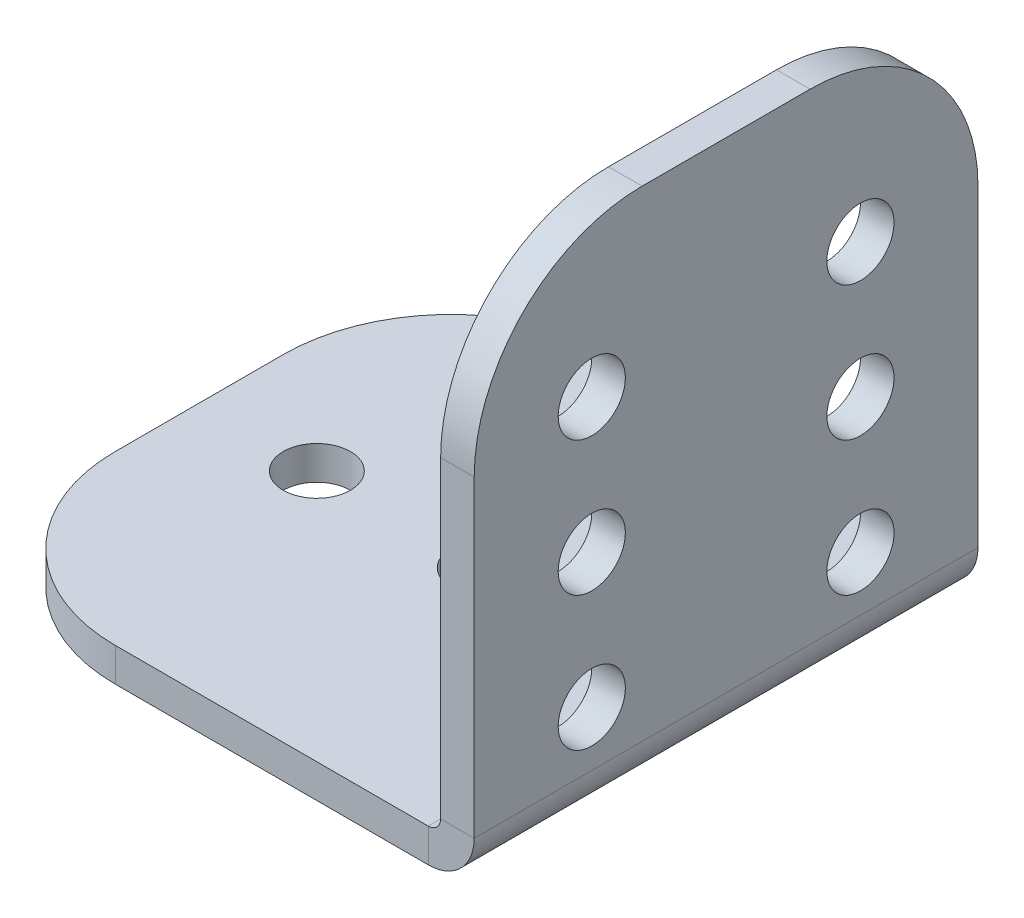
ISO-10303-21;
HEADER;
FILE_DESCRIPTION(('STEP AP214'),'2;1');
FILE_NAME('part.step','',(''),(''),'','','');
FILE_SCHEMA(('AUTOMOTIVE_DESIGN { 1 0 10303 214 1 1 1 1 }'));
ENDSEC;
DATA;
#1=APPLICATION_CONTEXT('core data for automotive mechanical design processes');
#2=APPLICATION_PROTOCOL_DEFINITION('international standard','automotive_design',2000,#1);
#3=PRODUCT_CONTEXT('',#1,'mechanical');
#4=PRODUCT('Part','Part','',(#3));
#5=PRODUCT_RELATED_PRODUCT_CATEGORY('part','',(#4));
#6=PRODUCT_DEFINITION_FORMATION('','',#4);
#7=PRODUCT_DEFINITION_CONTEXT('part definition',#1,'design');
#8=PRODUCT_DEFINITION('design','',#6,#7);
#9=PRODUCT_DEFINITION_SHAPE('','',#8);
#10=(LENGTH_UNIT() NAMED_UNIT(*) SI_UNIT(.MILLI.,.METRE.));
#11=(NAMED_UNIT(*) PLANE_ANGLE_UNIT() SI_UNIT($,.RADIAN.));
#12=(NAMED_UNIT(*) SI_UNIT($,.STERADIAN.) SOLID_ANGLE_UNIT());
#13=UNCERTAINTY_MEASURE_WITH_UNIT(LENGTH_MEASURE(1.E-05),#10,'distance_accuracy_value','');
#14=(GEOMETRIC_REPRESENTATION_CONTEXT(3) GLOBAL_UNCERTAINTY_ASSIGNED_CONTEXT((#13)) GLOBAL_UNIT_ASSIGNED_CONTEXT((#10,
#11,#12)) REPRESENTATION_CONTEXT('',''));
#15=CARTESIAN_POINT('',(0.,0.,0.));
#16=DIRECTION('',(0.,0.,1.));
#17=DIRECTION('',(1.,0.,0.));
#18=AXIS2_PLACEMENT_3D('',#15,#16,#17);
#19=CARTESIAN_POINT('',(1.37267754944405,-20.627322450556,15.));
#20=DIRECTION('',(0.,0.,1.));
#21=DIRECTION('',(0.,1.,0.));
#22=AXIS2_PLACEMENT_3D('',#19,#20,#21);
#23=PLANE('',#22);
#24=DIRECTION('',(0.,1.,0.));
#25=VECTOR('',#24,1.);
#26=CARTESIAN_POINT('',(-0.627322450555954,-20.627322450556,15.));
#27=LINE('',#26,#25);
#28=CARTESIAN_POINT('',(-0.627322450556028,0.736600000000016,15.));
#29=VERTEX_POINT('',#28);
#30=CARTESIAN_POINT('',(-0.627322450556093,19.372677549444,15.));
#31=VERTEX_POINT('',#30);
#32=EDGE_CURVE('E67',#29,#31,#27,.T.);
#33=ORIENTED_EDGE('',*,*,#32,.F.);
#34=DIRECTION('',(1.,0.,0.));
#35=VECTOR('',#34,1.);
#36=CARTESIAN_POINT('',(1.37267754944397,0.736600000000023,15.));
#37=LINE('',#36,#35);
#38=CARTESIAN_POINT('',(1.37267754944398,0.736600000000013,15.));
#39=VERTEX_POINT('',#38);
#40=EDGE_CURVE('E132',#29,#39,#37,.T.);
#41=ORIENTED_EDGE('',*,*,#40,.T.);
#42=DIRECTION('',(0.,1.,0.));
#43=VECTOR('',#42,1.);
#44=CARTESIAN_POINT('',(1.37267754944405,-20.627322450556,15.));
#45=LINE('',#44,#43);
#46=CARTESIAN_POINT('',(1.37267754944391,19.372677549444,15.));
#47=VERTEX_POINT('',#46);
#48=EDGE_CURVE('E134',#39,#47,#45,.T.);
#49=ORIENTED_EDGE('',*,*,#48,.T.);
#50=DIRECTION('',(-1.,0.,0.));
#51=VECTOR('',#50,1.);
#52=CARTESIAN_POINT('',(1.37267754944391,19.372677549444,15.));
#53=LINE('',#52,#51);
#54=EDGE_CURVE('E162',#47,#31,#53,.T.);
#55=ORIENTED_EDGE('',*,*,#54,.T.);
#56=EDGE_LOOP('',(#33,#41,#49,#55));
#57=FACE_BOUND('',#56,.T.);
#58=ADVANCED_FACE('F43',(#57),#23,.T.);
#59=CARTESIAN_POINT('',(1.37267754944402,-20.627322450556,-15.));
#60=DIRECTION('',(0.,0.,-1.));
#61=DIRECTION('',(0.,-1.,0.));
#62=AXIS2_PLACEMENT_3D('',#59,#60,#61);
#63=PLANE('',#62);
#64=DIRECTION('',(0.,-1.,0.));
#65=VECTOR('',#64,1.);
#66=CARTESIAN_POINT('',(1.37267754944402,-20.627322450556,-15.));
#67=LINE('',#66,#65);
#68=CARTESIAN_POINT('',(1.37267754944388,19.372677549444,-15.));
#69=VERTEX_POINT('',#68);
#70=CARTESIAN_POINT('',(1.37267754944394,0.736600000000037,-15.));
#71=VERTEX_POINT('',#70);
#72=EDGE_CURVE('E152',#69,#71,#67,.T.);
#73=ORIENTED_EDGE('',*,*,#72,.T.);
#74=DIRECTION('',(-1.,0.,0.));
#75=VECTOR('',#74,1.);
#76=CARTESIAN_POINT('',(1.37267754944394,0.736600000000023,-15.));
#77=LINE('',#76,#75);
#78=CARTESIAN_POINT('',(-0.627322450556056,0.736600000000016,-15.));
#79=VERTEX_POINT('',#78);
#80=EDGE_CURVE('E12',#71,#79,#77,.T.);
#81=ORIENTED_EDGE('',*,*,#80,.T.);
#82=DIRECTION('',(0.,-1.,0.));
#83=VECTOR('',#82,1.);
#84=CARTESIAN_POINT('',(-0.627322450555981,-20.627322450556,-15.));
#85=LINE('',#84,#83);
#86=CARTESIAN_POINT('',(-0.627322450556121,19.372677549444,-15.));
#87=VERTEX_POINT('',#86);
#88=EDGE_CURVE('E60',#87,#79,#85,.T.);
#89=ORIENTED_EDGE('',*,*,#88,.F.);
#90=DIRECTION('',(-1.,0.,0.));
#91=VECTOR('',#90,1.);
#92=CARTESIAN_POINT('',(1.37267754944388,19.372677549444,-15.));
#93=LINE('',#92,#91);
#94=EDGE_CURVE('E238',#69,#87,#93,.T.);
#95=ORIENTED_EDGE('',*,*,#94,.F.);
#96=EDGE_LOOP('',(#73,#81,#89,#95));
#97=FACE_BOUND('',#96,.T.);
#98=ADVANCED_FACE('F45',(#97),#63,.T.);
#99=CARTESIAN_POINT('',(-0.627322450556103,19.372677549444,5.00000000000002));
#100=DIRECTION('',(-1.,0.,0.));
#101=DIRECTION('',(0.,0.,1.));
#102=AXIS2_PLACEMENT_3D('',#99,#100,#101);
#103=PLANE('',#102);
#104=CARTESIAN_POINT('',(-0.627322450556046,4.,8.));
#105=DIRECTION('',(-1.,0.,0.));
#106=DIRECTION('',(0.,-1.,0.));
#107=AXIS2_PLACEMENT_3D('',#104,#105,#106);
#108=CIRCLE('',#107,2.);
#109=CARTESIAN_POINT('',(-0.627322450556039,2.,8.));
#110=VERTEX_POINT('',#109);
#111=EDGE_CURVE('E304',#110,#110,#108,.T.);
#112=ORIENTED_EDGE('',*,*,#111,.F.);
#113=EDGE_LOOP('',(#112));
#114=FACE_BOUND('',#113,.T.);
#115=CARTESIAN_POINT('',(-0.627322450556089,12.,-8.));
#116=DIRECTION('',(-1.,0.,0.));
#117=DIRECTION('',(0.,-1.,0.));
#118=AXIS2_PLACEMENT_3D('',#115,#116,#117);
#119=CIRCLE('',#118,2.);
#120=CARTESIAN_POINT('',(-0.627322450556082,10.,-8.));
#121=VERTEX_POINT('',#120);
#122=EDGE_CURVE('E308',#121,#121,#119,.T.);
#123=ORIENTED_EDGE('',*,*,#122,.F.);
#124=EDGE_LOOP('',(#123));
#125=FACE_BOUND('',#124,.T.);
#126=CARTESIAN_POINT('',(-0.627322450556117,20.,-8.));
#127=DIRECTION('',(-1.,0.,0.));
#128=DIRECTION('',(0.,-1.,0.));
#129=AXIS2_PLACEMENT_3D('',#126,#127,#128);
#130=CIRCLE('',#129,2.);
#131=CARTESIAN_POINT('',(-0.62732245055611,18.,-8.));
#132=VERTEX_POINT('',#131);
#133=EDGE_CURVE('E312',#132,#132,#130,.T.);
#134=ORIENTED_EDGE('',*,*,#133,.F.);
#135=EDGE_LOOP('',(#134));
#136=FACE_BOUND('',#135,.T.);
#137=CARTESIAN_POINT('',(-0.627322450556102,20.,8.));
#138=DIRECTION('',(-1.,0.,0.));
#139=DIRECTION('',(0.,-1.,0.));
#140=AXIS2_PLACEMENT_3D('',#137,#138,#139);
#141=CIRCLE('',#140,2.);
#142=CARTESIAN_POINT('',(-0.627322450556095,18.,8.));
#143=VERTEX_POINT('',#142);
#144=EDGE_CURVE('E316',#143,#143,#141,.T.);
#145=ORIENTED_EDGE('',*,*,#144,.F.);
#146=EDGE_LOOP('',(#145));
#147=FACE_BOUND('',#146,.T.);
#148=CARTESIAN_POINT('',(-0.627322450556074,12.,8.));
#149=DIRECTION('',(-1.,0.,0.));
#150=DIRECTION('',(0.,-1.,0.));
#151=AXIS2_PLACEMENT_3D('',#148,#149,#150);
#152=CIRCLE('',#151,2.);
#153=CARTESIAN_POINT('',(-0.627322450556067,10.,8.));
#154=VERTEX_POINT('',#153);
#155=EDGE_CURVE('E320',#154,#154,#152,.T.);
#156=ORIENTED_EDGE('',*,*,#155,.F.);
#157=EDGE_LOOP('',(#156));
#158=FACE_BOUND('',#157,.T.);
#159=CARTESIAN_POINT('',(-0.627322450556061,4.,-8.));
#160=DIRECTION('',(-1.,0.,0.));
#161=DIRECTION('',(0.,-1.,0.));
#162=AXIS2_PLACEMENT_3D('',#159,#160,#161);
#163=CIRCLE('',#162,2.);
#164=CARTESIAN_POINT('',(-0.627322450556054,2.,-8.));
#165=VERTEX_POINT('',#164);
#166=EDGE_CURVE('E251',#165,#165,#163,.T.);
#167=ORIENTED_EDGE('',*,*,#166,.F.);
#168=EDGE_LOOP('',(#167));
#169=FACE_BOUND('',#168,.T.);
#170=ORIENTED_EDGE('',*,*,#88,.T.);
#171=DIRECTION('',(0.,0.,1.));
#172=VECTOR('',#171,1.);
#173=CARTESIAN_POINT('',(-0.627322450556038,0.736600000000015,5.00000000000002));
#174=LINE('',#173,#172);
#175=EDGE_CURVE('E52',#79,#29,#174,.T.);
#176=ORIENTED_EDGE('',*,*,#175,.T.);
#177=ORIENTED_EDGE('',*,*,#32,.T.);
#178=CARTESIAN_POINT('',(-0.627322450556103,19.372677549444,5.00000000000002));
#179=DIRECTION('',(-1.,0.,0.));
#180=DIRECTION('',(0.,0.,1.));
#181=AXIS2_PLACEMENT_3D('',#178,#179,#180);
#182=CIRCLE('',#181,10.);
#183=CARTESIAN_POINT('',(-0.627322450556137,29.372677549444,5.00000000000003));
#184=VERTEX_POINT('',#183);
#185=EDGE_CURVE('E184',#31,#184,#182,.T.);
#186=ORIENTED_EDGE('',*,*,#185,.T.);
#187=DIRECTION('',(0.,0.,-1.));
#188=VECTOR('',#187,1.);
#189=CARTESIAN_POINT('',(-0.627322450556137,29.372677549444,5.00000000000003));
#190=LINE('',#189,#188);
#191=CARTESIAN_POINT('',(-0.627322450556147,29.372677549444,-4.99999999999997));
#192=VERTEX_POINT('',#191);
#193=EDGE_CURVE('E232',#184,#192,#190,.T.);
#194=ORIENTED_EDGE('',*,*,#193,.T.);
#195=CARTESIAN_POINT('',(-0.627322450556112,19.372677549444,-4.99999999999998));
#196=DIRECTION('',(-1.,0.,0.));
#197=DIRECTION('',(0.,0.,-1.));
#198=AXIS2_PLACEMENT_3D('',#195,#196,#197);
#199=CIRCLE('',#198,10.);
#200=EDGE_CURVE('E235',#192,#87,#199,.T.);
#201=ORIENTED_EDGE('',*,*,#200,.T.);
#202=EDGE_LOOP('',(#170,#176,#177,#186,#194,#201));
#203=FACE_BOUND('',#202,.T.);
#204=ADVANCED_FACE('F290',(#114,#125,#136,#147,#158,#169,#203),#103,.T.);
#205=CARTESIAN_POINT('',(1.3726775494439,19.372677549444,5.00000000000002));
#206=DIRECTION('',(-1.,0.,0.));
#207=DIRECTION('',(0.,0.,1.));
#208=AXIS2_PLACEMENT_3D('',#205,#206,#207);
#209=CYLINDRICAL_SURFACE('',#208,10.);
#210=ORIENTED_EDGE('',*,*,#185,.F.);
#211=ORIENTED_EDGE('',*,*,#54,.F.);
#212=CARTESIAN_POINT('',(1.3726775494439,19.372677549444,5.00000000000002));
#213=DIRECTION('',(-1.,0.,0.));
#214=DIRECTION('',(0.,0.,1.));
#215=AXIS2_PLACEMENT_3D('',#212,#213,#214);
#216=CIRCLE('',#215,10.);
#217=CARTESIAN_POINT('',(1.37267754944386,29.372677549444,5.00000000000002));
#218=VERTEX_POINT('',#217);
#219=EDGE_CURVE('E150',#47,#218,#216,.T.);
#220=ORIENTED_EDGE('',*,*,#219,.T.);
#221=DIRECTION('',(-1.,0.,0.));
#222=VECTOR('',#221,1.);
#223=CARTESIAN_POINT('',(1.37267754944386,29.372677549444,5.00000000000002));
#224=LINE('',#223,#222);
#225=EDGE_CURVE('E151',#218,#184,#224,.T.);
#226=ORIENTED_EDGE('',*,*,#225,.T.);
#227=EDGE_LOOP('',(#210,#211,#220,#226));
#228=FACE_BOUND('',#227,.T.);
#229=ADVANCED_FACE('F295',(#228),#209,.T.);
#230=CARTESIAN_POINT('',(1.37267754944389,19.372677549444,-4.99999999999998));
#231=DIRECTION('',(-1.,0.,0.));
#232=DIRECTION('',(0.,0.,1.));
#233=AXIS2_PLACEMENT_3D('',#230,#231,#232);
#234=CYLINDRICAL_SURFACE('',#233,10.);
#235=ORIENTED_EDGE('',*,*,#200,.F.);
#236=DIRECTION('',(-1.,0.,0.));
#237=VECTOR('',#236,1.);
#238=CARTESIAN_POINT('',(1.37267754944385,29.372677549444,-4.99999999999997));
#239=LINE('',#238,#237);
#240=CARTESIAN_POINT('',(1.37267754944385,29.372677549444,-4.99999999999997));
#241=VERTEX_POINT('',#240);
#242=EDGE_CURVE('E240',#241,#192,#239,.T.);
#243=ORIENTED_EDGE('',*,*,#242,.F.);
#244=CARTESIAN_POINT('',(1.37267754944389,19.372677549444,-4.99999999999998));
#245=DIRECTION('',(-1.,0.,0.));
#246=DIRECTION('',(0.,0.,-1.));
#247=AXIS2_PLACEMENT_3D('',#244,#245,#246);
#248=CIRCLE('',#247,10.);
#249=EDGE_CURVE('E227',#241,#69,#248,.T.);
#250=ORIENTED_EDGE('',*,*,#249,.T.);
#251=ORIENTED_EDGE('',*,*,#94,.T.);
#252=EDGE_LOOP('',(#235,#243,#250,#251));
#253=FACE_BOUND('',#252,.T.);
#254=ADVANCED_FACE('F300',(#253),#234,.T.);
#255=CARTESIAN_POINT('',(1.37267754944386,29.372677549444,5.00000000000002));
#256=DIRECTION('',(0.,1.,0.));
#257=DIRECTION('',(0.,0.,-1.));
#258=AXIS2_PLACEMENT_3D('',#255,#256,#257);
#259=PLANE('',#258);
#260=ORIENTED_EDGE('',*,*,#193,.F.);
#261=ORIENTED_EDGE('',*,*,#225,.F.);
#262=DIRECTION('',(0.,0.,-1.));
#263=VECTOR('',#262,1.);
#264=CARTESIAN_POINT('',(1.37267754944386,29.372677549444,5.00000000000002));
#265=LINE('',#264,#263);
#266=EDGE_CURVE('E224',#218,#241,#265,.T.);
#267=ORIENTED_EDGE('',*,*,#266,.T.);
#268=ORIENTED_EDGE('',*,*,#242,.T.);
#269=EDGE_LOOP('',(#260,#261,#267,#268));
#270=FACE_BOUND('',#269,.T.);
#271=ADVANCED_FACE('F367',(#270),#259,.T.);
#272=CARTESIAN_POINT('',(1.3726775494439,19.372677549444,5.00000000000002));
#273=DIRECTION('',(-1.,0.,0.));
#274=DIRECTION('',(0.,0.,1.));
#275=AXIS2_PLACEMENT_3D('',#272,#273,#274);
#276=PLANE('',#275);
#277=CARTESIAN_POINT('',(1.37267754944395,4.00000000000001,8.));
#278=DIRECTION('',(-1.,0.,0.));
#279=DIRECTION('',(0.,-1.,0.));
#280=AXIS2_PLACEMENT_3D('',#277,#278,#279);
#281=CIRCLE('',#280,2.);
#282=CARTESIAN_POINT('',(1.37267754944396,2.00000000000001,8.));
#283=VERTEX_POINT('',#282);
#284=EDGE_CURVE('E47',#283,#283,#281,.T.);
#285=ORIENTED_EDGE('',*,*,#284,.T.);
#286=EDGE_LOOP('',(#285));
#287=FACE_BOUND('',#286,.T.);
#288=CARTESIAN_POINT('',(1.37267754944391,12.,-8.));
#289=DIRECTION('',(-1.,0.,0.));
#290=DIRECTION('',(0.,-1.,0.));
#291=AXIS2_PLACEMENT_3D('',#288,#289,#290);
#292=CIRCLE('',#291,2.);
#293=CARTESIAN_POINT('',(1.37267754944392,10.,-8.));
#294=VERTEX_POINT('',#293);
#295=EDGE_CURVE('E259',#294,#294,#292,.T.);
#296=ORIENTED_EDGE('',*,*,#295,.T.);
#297=EDGE_LOOP('',(#296));
#298=FACE_BOUND('',#297,.T.);
#299=CARTESIAN_POINT('',(1.37267754944388,20.,-8.));
#300=DIRECTION('',(-1.,0.,0.));
#301=DIRECTION('',(0.,-1.,0.));
#302=AXIS2_PLACEMENT_3D('',#299,#300,#301);
#303=CIRCLE('',#302,2.);
#304=CARTESIAN_POINT('',(1.37267754944389,18.,-8.));
#305=VERTEX_POINT('',#304);
#306=EDGE_CURVE('E257',#305,#305,#303,.T.);
#307=ORIENTED_EDGE('',*,*,#306,.T.);
#308=EDGE_LOOP('',(#307));
#309=FACE_BOUND('',#308,.T.);
#310=CARTESIAN_POINT('',(1.3726775494439,20.,8.));
#311=DIRECTION('',(-1.,0.,0.));
#312=DIRECTION('',(0.,-1.,0.));
#313=AXIS2_PLACEMENT_3D('',#310,#311,#312);
#314=CIRCLE('',#313,2.);
#315=CARTESIAN_POINT('',(1.37267754944391,18.,8.));
#316=VERTEX_POINT('',#315);
#317=EDGE_CURVE('E254',#316,#316,#314,.T.);
#318=ORIENTED_EDGE('',*,*,#317,.T.);
#319=EDGE_LOOP('',(#318));
#320=FACE_BOUND('',#319,.T.);
#321=CARTESIAN_POINT('',(1.37267754944393,12.,8.));
#322=DIRECTION('',(-1.,0.,0.));
#323=DIRECTION('',(0.,-1.,0.));
#324=AXIS2_PLACEMENT_3D('',#321,#322,#323);
#325=CIRCLE('',#324,2.);
#326=CARTESIAN_POINT('',(1.37267754944393,10.,8.));
#327=VERTEX_POINT('',#326);
#328=EDGE_CURVE('E250',#327,#327,#325,.T.);
#329=ORIENTED_EDGE('',*,*,#328,.T.);
#330=EDGE_LOOP('',(#329));
#331=FACE_BOUND('',#330,.T.);
#332=CARTESIAN_POINT('',(1.37267754944394,4.,-8.));
#333=DIRECTION('',(-1.,0.,0.));
#334=DIRECTION('',(0.,-1.,0.));
#335=AXIS2_PLACEMENT_3D('',#332,#333,#334);
#336=CIRCLE('',#335,2.);
#337=CARTESIAN_POINT('',(1.37267754944395,2.,-8.));
#338=VERTEX_POINT('',#337);
#339=EDGE_CURVE('E247',#338,#338,#336,.T.);
#340=ORIENTED_EDGE('',*,*,#339,.T.);
#341=EDGE_LOOP('',(#340));
#342=FACE_BOUND('',#341,.T.);
#343=DIRECTION('',(0.,0.,1.));
#344=VECTOR('',#343,1.);
#345=CARTESIAN_POINT('',(1.37267754944396,0.736600000000022,5.00000000000002));
#346=LINE('',#345,#344);
#347=EDGE_CURVE('E140',#71,#39,#346,.T.);
#348=ORIENTED_EDGE('',*,*,#347,.F.);
#349=ORIENTED_EDGE('',*,*,#72,.F.);
#350=ORIENTED_EDGE('',*,*,#249,.F.);
#351=ORIENTED_EDGE('',*,*,#266,.F.);
#352=ORIENTED_EDGE('',*,*,#219,.F.);
#353=ORIENTED_EDGE('',*,*,#48,.F.);
#354=EDGE_LOOP('',(#348,#349,#350,#351,#352,#353));
#355=FACE_BOUND('',#354,.T.);
#356=ADVANCED_FACE('F145',(#287,#298,#309,#320,#331,#342,#355),#276,.F.);
#357=CARTESIAN_POINT('',(-20.,-2.,-5.));
#358=DIRECTION('',(0.,1.,0.));
#359=DIRECTION('',(0.,0.,1.));
#360=AXIS2_PLACEMENT_3D('',#357,#358,#359);
#361=CYLINDRICAL_SURFACE('',#360,10.);
#362=CARTESIAN_POINT('',(-20.,0.,-5.));
#363=DIRECTION('',(0.,1.,0.));
#364=DIRECTION('',(0.,0.,-1.));
#365=AXIS2_PLACEMENT_3D('',#362,#363,#364);
#366=CIRCLE('',#365,10.);
#367=CARTESIAN_POINT('',(-20.,0.,-15.));
#368=VERTEX_POINT('',#367);
#369=CARTESIAN_POINT('',(-30.,0.,-5.));
#370=VERTEX_POINT('',#369);
#371=EDGE_CURVE('E195',#368,#370,#366,.T.);
#372=ORIENTED_EDGE('',*,*,#371,.F.);
#373=DIRECTION('',(0.,1.,0.));
#374=VECTOR('',#373,1.);
#375=CARTESIAN_POINT('',(-20.,-2.,-15.));
#376=LINE('',#375,#374);
#377=CARTESIAN_POINT('',(-20.,-2.,-15.));
#378=VERTEX_POINT('',#377);
#379=EDGE_CURVE('E181',#378,#368,#376,.T.);
#380=ORIENTED_EDGE('',*,*,#379,.F.);
#381=CARTESIAN_POINT('',(-20.,-2.,-5.));
#382=DIRECTION('',(0.,1.,0.));
#383=DIRECTION('',(0.,0.,-1.));
#384=AXIS2_PLACEMENT_3D('',#381,#382,#383);
#385=CIRCLE('',#384,10.);
#386=CARTESIAN_POINT('',(-30.,-2.,-5.));
#387=VERTEX_POINT('',#386);
#388=EDGE_CURVE('E217',#378,#387,#385,.T.);
#389=ORIENTED_EDGE('',*,*,#388,.T.);
#390=DIRECTION('',(0.,1.,0.));
#391=VECTOR('',#390,1.);
#392=CARTESIAN_POINT('',(-30.,-2.,-5.));
#393=LINE('',#392,#391);
#394=EDGE_CURVE('E215',#387,#370,#393,.T.);
#395=ORIENTED_EDGE('',*,*,#394,.T.);
#396=EDGE_LOOP('',(#372,#380,#389,#395));
#397=FACE_BOUND('',#396,.T.);
#398=ADVANCED_FACE('F394',(#397),#361,.T.);
#399=CARTESIAN_POINT('',(-30.,-2.,5.));
#400=DIRECTION('',(-1.,0.,0.));
#401=DIRECTION('',(0.,0.,1.));
#402=AXIS2_PLACEMENT_3D('',#399,#400,#401);
#403=PLANE('',#402);
#404=DIRECTION('',(0.,0.,1.));
#405=VECTOR('',#404,1.);
#406=CARTESIAN_POINT('',(-30.,0.,5.));
#407=LINE('',#406,#405);
#408=CARTESIAN_POINT('',(-30.,0.,5.));
#409=VERTEX_POINT('',#408);
#410=EDGE_CURVE('E192',#370,#409,#407,.T.);
#411=ORIENTED_EDGE('',*,*,#410,.F.);
#412=ORIENTED_EDGE('',*,*,#394,.F.);
#413=DIRECTION('',(0.,0.,1.));
#414=VECTOR('',#413,1.);
#415=CARTESIAN_POINT('',(-30.,-2.,5.));
#416=LINE('',#415,#414);
#417=CARTESIAN_POINT('',(-30.,-2.,5.));
#418=VERTEX_POINT('',#417);
#419=EDGE_CURVE('E212',#387,#418,#416,.T.);
#420=ORIENTED_EDGE('',*,*,#419,.T.);
#421=DIRECTION('',(0.,1.,0.));
#422=VECTOR('',#421,1.);
#423=CARTESIAN_POINT('',(-30.,-2.,5.));
#424=LINE('',#423,#422);
#425=EDGE_CURVE('E210',#418,#409,#424,.T.);
#426=ORIENTED_EDGE('',*,*,#425,.T.);
#427=EDGE_LOOP('',(#411,#412,#420,#426));
#428=FACE_BOUND('',#427,.T.);
#429=ADVANCED_FACE('F390',(#428),#403,.T.);
#430=CARTESIAN_POINT('',(-20.,-2.,5.));
#431=DIRECTION('',(0.,1.,0.));
#432=DIRECTION('',(0.,0.,1.));
#433=AXIS2_PLACEMENT_3D('',#430,#431,#432);
#434=CYLINDRICAL_SURFACE('',#433,10.);
#435=CARTESIAN_POINT('',(-20.,0.,5.));
#436=DIRECTION('',(0.,1.,0.));
#437=DIRECTION('',(0.,0.,-1.));
#438=AXIS2_PLACEMENT_3D('',#435,#436,#437);
#439=CIRCLE('',#438,10.);
#440=CARTESIAN_POINT('',(-20.,0.,15.));
#441=VERTEX_POINT('',#440);
#442=EDGE_CURVE('E189',#409,#441,#439,.T.);
#443=ORIENTED_EDGE('',*,*,#442,.F.);
#444=ORIENTED_EDGE('',*,*,#425,.F.);
#445=CARTESIAN_POINT('',(-20.,-2.,5.));
#446=DIRECTION('',(0.,1.,0.));
#447=DIRECTION('',(0.,0.,-1.));
#448=AXIS2_PLACEMENT_3D('',#445,#446,#447);
#449=CIRCLE('',#448,10.);
#450=CARTESIAN_POINT('',(-20.,-2.,15.));
#451=VERTEX_POINT('',#450);
#452=EDGE_CURVE('E207',#418,#451,#449,.T.);
#453=ORIENTED_EDGE('',*,*,#452,.T.);
#454=DIRECTION('',(0.,1.,0.));
#455=VECTOR('',#454,1.);
#456=CARTESIAN_POINT('',(-20.,-2.,15.));
#457=LINE('',#456,#455);
#458=EDGE_CURVE('E205',#451,#441,#457,.T.);
#459=ORIENTED_EDGE('',*,*,#458,.T.);
#460=EDGE_LOOP('',(#443,#444,#453,#459));
#461=FACE_BOUND('',#460,.T.);
#462=ADVANCED_FACE('F386',(#461),#434,.T.);
#463=CARTESIAN_POINT('',(20.,-2.,5.));
#464=DIRECTION('',(0.,1.,0.));
#465=DIRECTION('',(0.,0.,1.));
#466=AXIS2_PLACEMENT_3D('',#463,#464,#465);
#467=PLANE('',#466);
#468=CARTESIAN_POINT('',(-23.,-2.,0.));
#469=DIRECTION('',(0.,1.,0.));
#470=DIRECTION('',(0.,0.,1.));
#471=AXIS2_PLACEMENT_3D('',#468,#469,#470);
#472=CIRCLE('',#471,2.);
#473=CARTESIAN_POINT('',(-23.,-2.,2.));
#474=VERTEX_POINT('',#473);
#475=EDGE_CURVE('E330',#474,#474,#472,.T.);
#476=ORIENTED_EDGE('',*,*,#475,.T.);
#477=EDGE_LOOP('',(#476));
#478=FACE_BOUND('',#477,.T.);
#479=CARTESIAN_POINT('',(-13.,-2.,0.));
#480=DIRECTION('',(0.,1.,0.));
#481=DIRECTION('',(0.,0.,1.));
#482=AXIS2_PLACEMENT_3D('',#479,#480,#481);
#483=CIRCLE('',#482,2.);
#484=CARTESIAN_POINT('',(-13.,-2.,2.));
#485=VERTEX_POINT('',#484);
#486=EDGE_CURVE('E333',#485,#485,#483,.T.);
#487=ORIENTED_EDGE('',*,*,#486,.T.);
#488=EDGE_LOOP('',(#487));
#489=FACE_BOUND('',#488,.T.);
#490=DIRECTION('',(-1.,0.,0.));
#491=VECTOR('',#490,1.);
#492=CARTESIAN_POINT('',(-20.,-2.,-15.));
#493=LINE('',#492,#491);
#494=CARTESIAN_POINT('',(-1.36392245055603,-2.,-15.));
#495=VERTEX_POINT('',#494);
#496=EDGE_CURVE('E185',#495,#378,#493,.T.);
#497=ORIENTED_EDGE('',*,*,#496,.F.);
#498=DIRECTION('',(0.,0.,1.));
#499=VECTOR('',#498,1.);
#500=CARTESIAN_POINT('',(-1.36392245055603,-2.,5.00000000000002));
#501=LINE('',#500,#499);
#502=CARTESIAN_POINT('',(-1.36392245055603,-2.,15.));
#503=VERTEX_POINT('',#502);
#504=EDGE_CURVE('E202',#495,#503,#501,.T.);
#505=ORIENTED_EDGE('',*,*,#504,.T.);
#506=DIRECTION('',(1.,0.,0.));
#507=VECTOR('',#506,1.);
#508=CARTESIAN_POINT('',(-20.,-2.,15.));
#509=LINE('',#508,#507);
#510=EDGE_CURVE('E200',#451,#503,#509,.T.);
#511=ORIENTED_EDGE('',*,*,#510,.F.);
#512=ORIENTED_EDGE('',*,*,#452,.F.);
#513=ORIENTED_EDGE('',*,*,#419,.F.);
#514=ORIENTED_EDGE('',*,*,#388,.F.);
#515=EDGE_LOOP('',(#497,#505,#511,#512,#513,#514));
#516=FACE_BOUND('',#515,.T.);
#517=ADVANCED_FACE('F382',(#478,#489,#516),#467,.F.);
#518=CARTESIAN_POINT('',(-20.,-2.,15.));
#519=DIRECTION('',(0.,0.,1.));
#520=DIRECTION('',(1.,0.,0.));
#521=AXIS2_PLACEMENT_3D('',#518,#519,#520);
#522=PLANE('',#521);
#523=DIRECTION('',(0.,-1.,0.));
#524=VECTOR('',#523,1.);
#525=CARTESIAN_POINT('',(-1.36392245055602,-2.,15.));
#526=LINE('',#525,#524);
#527=CARTESIAN_POINT('',(-1.36392245055603,0.,15.));
#528=VERTEX_POINT('',#527);
#529=EDGE_CURVE('E167',#528,#503,#526,.T.);
#530=ORIENTED_EDGE('',*,*,#529,.F.);
#531=DIRECTION('',(1.,0.,0.));
#532=VECTOR('',#531,1.);
#533=CARTESIAN_POINT('',(-20.,0.,15.));
#534=LINE('',#533,#532);
#535=EDGE_CURVE('E187',#441,#528,#534,.T.);
#536=ORIENTED_EDGE('',*,*,#535,.F.);
#537=ORIENTED_EDGE('',*,*,#458,.F.);
#538=ORIENTED_EDGE('',*,*,#510,.T.);
#539=EDGE_LOOP('',(#530,#536,#537,#538));
#540=FACE_BOUND('',#539,.T.);
#541=ADVANCED_FACE('F349',(#540),#522,.T.);
#542=CARTESIAN_POINT('',(20.,0.,5.));
#543=DIRECTION('',(0.,1.,0.));
#544=DIRECTION('',(0.,0.,1.));
#545=AXIS2_PLACEMENT_3D('',#542,#543,#544);
#546=PLANE('',#545);
#547=CARTESIAN_POINT('',(-23.,0.,0.));
#548=DIRECTION('',(0.,1.,0.));
#549=DIRECTION('',(0.,0.,1.));
#550=AXIS2_PLACEMENT_3D('',#547,#548,#549);
#551=CIRCLE('',#550,2.);
#552=CARTESIAN_POINT('',(-23.,0.,2.));
#553=VERTEX_POINT('',#552);
#554=EDGE_CURVE('E336',#553,#553,#551,.T.);
#555=ORIENTED_EDGE('',*,*,#554,.F.);
#556=EDGE_LOOP('',(#555));
#557=FACE_BOUND('',#556,.T.);
#558=CARTESIAN_POINT('',(-13.,0.,0.));
#559=DIRECTION('',(0.,1.,0.));
#560=DIRECTION('',(0.,0.,1.));
#561=AXIS2_PLACEMENT_3D('',#558,#559,#560);
#562=CIRCLE('',#561,2.);
#563=CARTESIAN_POINT('',(-13.,0.,2.));
#564=VERTEX_POINT('',#563);
#565=EDGE_CURVE('E337',#564,#564,#562,.T.);
#566=ORIENTED_EDGE('',*,*,#565,.F.);
#567=EDGE_LOOP('',(#566));
#568=FACE_BOUND('',#567,.T.);
#569=DIRECTION('',(0.,0.,1.));
#570=VECTOR('',#569,1.);
#571=CARTESIAN_POINT('',(-1.36392245055603,0.,5.00000000000002));
#572=LINE('',#571,#570);
#573=CARTESIAN_POINT('',(-1.36392245055603,0.,-15.));
#574=VERTEX_POINT('',#573);
#575=EDGE_CURVE('E171',#574,#528,#572,.T.);
#576=ORIENTED_EDGE('',*,*,#575,.F.);
#577=DIRECTION('',(-1.,0.,0.));
#578=VECTOR('',#577,1.);
#579=CARTESIAN_POINT('',(-20.,0.,-15.));
#580=LINE('',#579,#578);
#581=EDGE_CURVE('E198',#574,#368,#580,.T.);
#582=ORIENTED_EDGE('',*,*,#581,.T.);
#583=ORIENTED_EDGE('',*,*,#371,.T.);
#584=ORIENTED_EDGE('',*,*,#410,.T.);
#585=ORIENTED_EDGE('',*,*,#442,.T.);
#586=ORIENTED_EDGE('',*,*,#535,.T.);
#587=EDGE_LOOP('',(#576,#582,#583,#584,#585,#586));
#588=FACE_BOUND('',#587,.T.);
#589=ADVANCED_FACE('F345',(#557,#568,#588),#546,.T.);
#590=CARTESIAN_POINT('',(-20.,-2.,-15.));
#591=DIRECTION('',(0.,0.,-1.));
#592=DIRECTION('',(-1.,0.,0.));
#593=AXIS2_PLACEMENT_3D('',#590,#591,#592);
#594=PLANE('',#593);
#595=DIRECTION('',(0.,1.,0.));
#596=VECTOR('',#595,1.);
#597=CARTESIAN_POINT('',(-1.36392245055604,-2.,-15.));
#598=LINE('',#597,#596);
#599=EDGE_CURVE('E168',#495,#574,#598,.T.);
#600=ORIENTED_EDGE('',*,*,#599,.F.);
#601=ORIENTED_EDGE('',*,*,#496,.T.);
#602=ORIENTED_EDGE('',*,*,#379,.T.);
#603=ORIENTED_EDGE('',*,*,#581,.F.);
#604=EDGE_LOOP('',(#600,#601,#602,#603));
#605=FACE_BOUND('',#604,.T.);
#606=ADVANCED_FACE('F348',(#605),#594,.T.);
#607=CARTESIAN_POINT('',(-1.36392245055604,0.7366,-15.));
#608=DIRECTION('',(0.,0.,-1.));
#609=DIRECTION('',(-1.,0.,0.));
#610=AXIS2_PLACEMENT_3D('',#607,#608,#609);
#611=PLANE('',#610);
#612=ORIENTED_EDGE('',*,*,#599,.T.);
#613=CARTESIAN_POINT('',(-1.36392245055604,0.7366,-15.));
#614=DIRECTION('',(0.,0.,1.));
#615=DIRECTION('',(1.,0.,0.));
#616=AXIS2_PLACEMENT_3D('',#613,#614,#615);
#617=CIRCLE('',#616,0.7366);
#618=EDGE_CURVE('E178',#574,#79,#617,.T.);
#619=ORIENTED_EDGE('',*,*,#618,.T.);
#620=ORIENTED_EDGE('',*,*,#80,.F.);
#621=CARTESIAN_POINT('',(-1.36392245055604,0.7366,-15.));
#622=DIRECTION('',(0.,0.,1.));
#623=DIRECTION('',(-1.,0.,0.));
#624=AXIS2_PLACEMENT_3D('',#621,#622,#623);
#625=CIRCLE('',#624,2.7366);
#626=EDGE_CURVE('E161',#495,#71,#625,.T.);
#627=ORIENTED_EDGE('',*,*,#626,.F.);
#628=EDGE_LOOP('',(#612,#619,#620,#627));
#629=FACE_BOUND('',#628,.T.);
#630=ADVANCED_FACE('F359',(#629),#611,.T.);
#631=CARTESIAN_POINT('',(-1.36392245055602,0.7366,15.));
#632=DIRECTION('',(0.,0.,1.));
#633=DIRECTION('',(1.,0.,0.));
#634=AXIS2_PLACEMENT_3D('',#631,#632,#633);
#635=PLANE('',#634);
#636=ORIENTED_EDGE('',*,*,#40,.F.);
#637=CARTESIAN_POINT('',(-1.36392245055602,0.7366,15.));
#638=DIRECTION('',(0.,0.,1.));
#639=DIRECTION('',(1.,0.,0.));
#640=AXIS2_PLACEMENT_3D('',#637,#638,#639);
#641=CIRCLE('',#640,0.7366);
#642=EDGE_CURVE('E173',#29,#528,#641,.F.);
#643=ORIENTED_EDGE('',*,*,#642,.T.);
#644=ORIENTED_EDGE('',*,*,#529,.T.);
#645=CARTESIAN_POINT('',(-1.36392245055602,0.7366,15.));
#646=DIRECTION('',(0.,0.,-1.));
#647=DIRECTION('',(1.,0.,0.));
#648=AXIS2_PLACEMENT_3D('',#645,#646,#647);
#649=CIRCLE('',#648,2.7366);
#650=EDGE_CURVE('E159',#39,#503,#649,.T.);
#651=ORIENTED_EDGE('',*,*,#650,.F.);
#652=EDGE_LOOP('',(#636,#643,#644,#651));
#653=FACE_BOUND('',#652,.T.);
#654=ADVANCED_FACE('F165',(#653),#635,.T.);
#655=CARTESIAN_POINT('',(-1.36392245055606,0.7366,-30.1900834348718));
#656=DIRECTION('',(0.,0.,1.));
#657=DIRECTION('',(1.,0.,0.));
#658=AXIS2_PLACEMENT_3D('',#655,#656,#657);
#659=CYLINDRICAL_SURFACE('',#658,2.7366);
#660=ORIENTED_EDGE('',*,*,#650,.T.);
#661=ORIENTED_EDGE('',*,*,#504,.F.);
#662=ORIENTED_EDGE('',*,*,#626,.T.);
#663=ORIENTED_EDGE('',*,*,#347,.T.);
#664=EDGE_LOOP('',(#660,#661,#662,#663));
#665=FACE_BOUND('',#664,.T.);
#666=ADVANCED_FACE('F157',(#665),#659,.T.);
#667=CARTESIAN_POINT('',(-1.36392245055606,0.7366,-30.1900834348718));
#668=DIRECTION('',(0.,0.,1.));
#669=DIRECTION('',(1.,0.,0.));
#670=AXIS2_PLACEMENT_3D('',#667,#668,#669);
#671=CYLINDRICAL_SURFACE('',#670,0.7366);
#672=ORIENTED_EDGE('',*,*,#642,.F.);
#673=ORIENTED_EDGE('',*,*,#175,.F.);
#674=ORIENTED_EDGE('',*,*,#618,.F.);
#675=ORIENTED_EDGE('',*,*,#575,.T.);
#676=EDGE_LOOP('',(#672,#673,#674,#675));
#677=FACE_BOUND('',#676,.T.);
#678=ADVANCED_FACE('F363',(#677),#671,.F.);
#679=CARTESIAN_POINT('',(9.37267754944394,4.00000000000003,-8.00000000000001));
#680=DIRECTION('',(-1.,0.,0.));
#681=DIRECTION('',(0.,-1.,0.));
#682=AXIS2_PLACEMENT_3D('',#679,#680,#681);
#683=CYLINDRICAL_SURFACE('',#682,2.);
#684=ORIENTED_EDGE('',*,*,#166,.T.);
#685=EDGE_LOOP('',(#684));
#686=FACE_BOUND('',#685,.T.);
#687=ORIENTED_EDGE('',*,*,#339,.F.);
#688=EDGE_LOOP('',(#687));
#689=FACE_BOUND('',#688,.T.);
#690=ADVANCED_FACE('F405',(#686,#689),#683,.F.);
#691=CARTESIAN_POINT('',(9.37267754944393,12.,7.99999999999999));
#692=DIRECTION('',(-1.,0.,0.));
#693=DIRECTION('',(0.,-1.,0.));
#694=AXIS2_PLACEMENT_3D('',#691,#692,#693);
#695=CYLINDRICAL_SURFACE('',#694,2.);
#696=ORIENTED_EDGE('',*,*,#155,.T.);
#697=EDGE_LOOP('',(#696));
#698=FACE_BOUND('',#697,.T.);
#699=ORIENTED_EDGE('',*,*,#328,.F.);
#700=EDGE_LOOP('',(#699));
#701=FACE_BOUND('',#700,.T.);
#702=ADVANCED_FACE('F410',(#698,#701),#695,.F.);
#703=CARTESIAN_POINT('',(9.3726775494439,20.,7.99999999999999));
#704=DIRECTION('',(-1.,0.,0.));
#705=DIRECTION('',(0.,-1.,0.));
#706=AXIS2_PLACEMENT_3D('',#703,#704,#705);
#707=CYLINDRICAL_SURFACE('',#706,2.);
#708=ORIENTED_EDGE('',*,*,#144,.T.);
#709=EDGE_LOOP('',(#708));
#710=FACE_BOUND('',#709,.T.);
#711=ORIENTED_EDGE('',*,*,#317,.F.);
#712=EDGE_LOOP('',(#711));
#713=FACE_BOUND('',#712,.T.);
#714=ADVANCED_FACE('F411',(#710,#713),#707,.F.);
#715=CARTESIAN_POINT('',(9.37267754944388,20.,-8.00000000000001));
#716=DIRECTION('',(-1.,0.,0.));
#717=DIRECTION('',(0.,-1.,0.));
#718=AXIS2_PLACEMENT_3D('',#715,#716,#717);
#719=CYLINDRICAL_SURFACE('',#718,2.);
#720=ORIENTED_EDGE('',*,*,#133,.T.);
#721=EDGE_LOOP('',(#720));
#722=FACE_BOUND('',#721,.T.);
#723=ORIENTED_EDGE('',*,*,#306,.F.);
#724=EDGE_LOOP('',(#723));
#725=FACE_BOUND('',#724,.T.);
#726=ADVANCED_FACE('F280',(#722,#725),#719,.F.);
#727=CARTESIAN_POINT('',(9.37267754944391,12.,-8.00000000000001));
#728=DIRECTION('',(-1.,0.,0.));
#729=DIRECTION('',(0.,-1.,0.));
#730=AXIS2_PLACEMENT_3D('',#727,#728,#729);
#731=CYLINDRICAL_SURFACE('',#730,2.);
#732=ORIENTED_EDGE('',*,*,#122,.T.);
#733=EDGE_LOOP('',(#732));
#734=FACE_BOUND('',#733,.T.);
#735=ORIENTED_EDGE('',*,*,#295,.F.);
#736=EDGE_LOOP('',(#735));
#737=FACE_BOUND('',#736,.T.);
#738=ADVANCED_FACE('F270',(#734,#737),#731,.F.);
#739=CARTESIAN_POINT('',(9.37267754944395,4.00000000000003,7.99999999999999));
#740=DIRECTION('',(-1.,0.,0.));
#741=DIRECTION('',(0.,-1.,0.));
#742=AXIS2_PLACEMENT_3D('',#739,#740,#741);
#743=CYLINDRICAL_SURFACE('',#742,2.);
#744=ORIENTED_EDGE('',*,*,#111,.T.);
#745=EDGE_LOOP('',(#744));
#746=FACE_BOUND('',#745,.T.);
#747=ORIENTED_EDGE('',*,*,#284,.F.);
#748=EDGE_LOOP('',(#747));
#749=FACE_BOUND('',#748,.T.);
#750=ADVANCED_FACE('F267',(#746,#749),#743,.F.);
#751=CARTESIAN_POINT('',(-13.,-10.,0.));
#752=DIRECTION('',(0.,1.,0.));
#753=DIRECTION('',(0.,0.,1.));
#754=AXIS2_PLACEMENT_3D('',#751,#752,#753);
#755=CYLINDRICAL_SURFACE('',#754,2.);
#756=ORIENTED_EDGE('',*,*,#565,.T.);
#757=EDGE_LOOP('',(#756));
#758=FACE_BOUND('',#757,.T.);
#759=ORIENTED_EDGE('',*,*,#486,.F.);
#760=EDGE_LOOP('',(#759));
#761=FACE_BOUND('',#760,.T.);
#762=ADVANCED_FACE('F269',(#758,#761),#755,.F.);
#763=CARTESIAN_POINT('',(-23.,-10.,0.));
#764=DIRECTION('',(0.,1.,0.));
#765=DIRECTION('',(0.,0.,1.));
#766=AXIS2_PLACEMENT_3D('',#763,#764,#765);
#767=CYLINDRICAL_SURFACE('',#766,2.);
#768=ORIENTED_EDGE('',*,*,#554,.T.);
#769=EDGE_LOOP('',(#768));
#770=FACE_BOUND('',#769,.T.);
#771=ORIENTED_EDGE('',*,*,#475,.F.);
#772=EDGE_LOOP('',(#771));
#773=FACE_BOUND('',#772,.T.);
#774=ADVANCED_FACE('F277',(#770,#773),#767,.F.);
#775=CLOSED_SHELL('',(#58,#98,#204,#229,#254,#271,#356,#398,#429,#462,#517,#541,#589,#606,#630,
#654,#666,#678,#690,#702,#714,#726,#738,#750,#762,#774));
#776=MANIFOLD_SOLID_BREP('B2',#775);
#777=ADVANCED_BREP_SHAPE_REPRESENTATION('',(#18,#776),#14);
#778=SHAPE_DEFINITION_REPRESENTATION(#9,#777);
ENDSEC;
END-ISO-10303-21;
